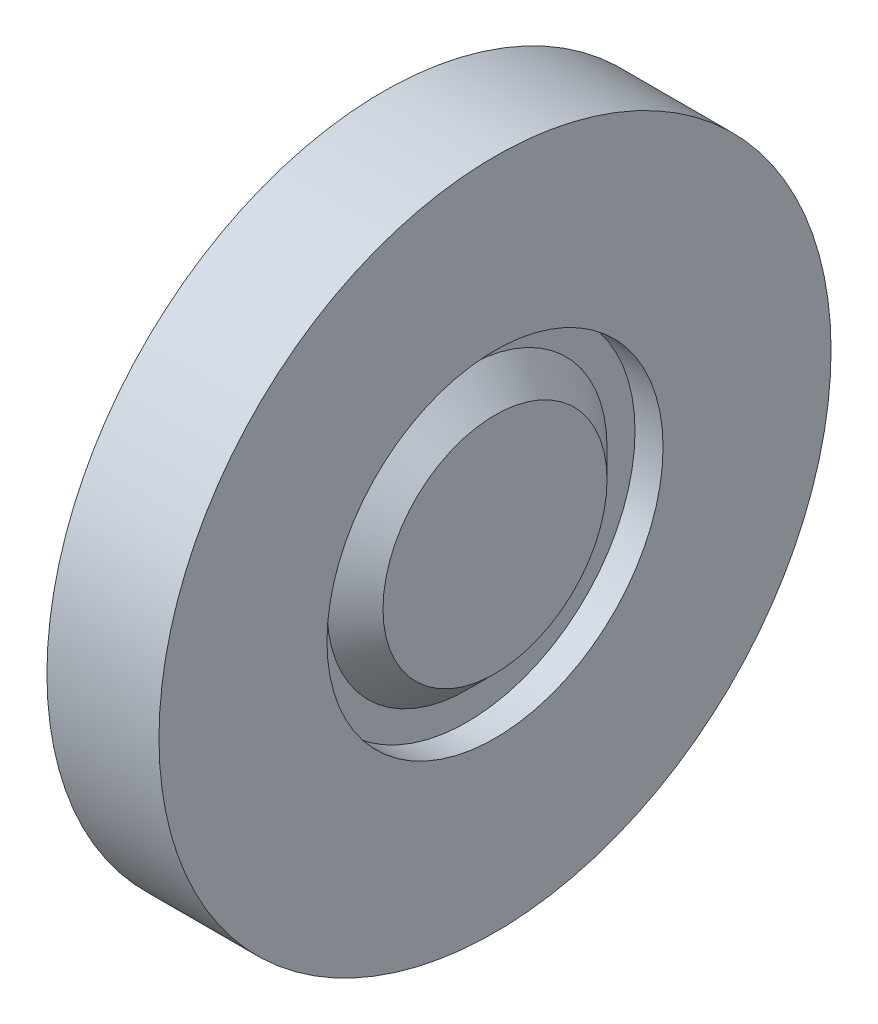
ISO-10303-21;
HEADER;
FILE_DESCRIPTION(('STEP AP214'),'2;1');
FILE_NAME('part.step','',(''),(''),'','','');
FILE_SCHEMA(('AUTOMOTIVE_DESIGN { 1 0 10303 214 1 1 1 1 }'));
ENDSEC;
DATA;
#1=APPLICATION_CONTEXT('core data for automotive mechanical design processes');
#2=APPLICATION_PROTOCOL_DEFINITION('international standard','automotive_design',2000,#1);
#3=PRODUCT_CONTEXT('',#1,'mechanical');
#4=PRODUCT('Part','Part','',(#3));
#5=PRODUCT_RELATED_PRODUCT_CATEGORY('part','',(#4));
#6=PRODUCT_DEFINITION_FORMATION('','',#4);
#7=PRODUCT_DEFINITION_CONTEXT('part definition',#1,'design');
#8=PRODUCT_DEFINITION('design','',#6,#7);
#9=PRODUCT_DEFINITION_SHAPE('','',#8);
#10=(LENGTH_UNIT() NAMED_UNIT(*) SI_UNIT(.MILLI.,.METRE.));
#11=(NAMED_UNIT(*) PLANE_ANGLE_UNIT() SI_UNIT($,.RADIAN.));
#12=(NAMED_UNIT(*) SI_UNIT($,.STERADIAN.) SOLID_ANGLE_UNIT());
#13=UNCERTAINTY_MEASURE_WITH_UNIT(LENGTH_MEASURE(1.E-05),#10,'distance_accuracy_value','');
#14=(GEOMETRIC_REPRESENTATION_CONTEXT(3) GLOBAL_UNCERTAINTY_ASSIGNED_CONTEXT((#13)) GLOBAL_UNIT_ASSIGNED_CONTEXT((#10,
#11,#12)) REPRESENTATION_CONTEXT('',''));
#15=CARTESIAN_POINT('',(0.,0.,0.));
#16=DIRECTION('',(0.,0.,1.));
#17=DIRECTION('',(1.,0.,0.));
#18=AXIS2_PLACEMENT_3D('',#15,#16,#17);
#19=CARTESIAN_POINT('',(1.5,0.,0.));
#20=DIRECTION('',(1.,0.,0.));
#21=DIRECTION('',(0.,0.,-1.));
#22=AXIS2_PLACEMENT_3D('',#19,#20,#21);
#23=PLANE('',#22);
#24=CARTESIAN_POINT('',(1.5,0.,0.));
#25=DIRECTION('',(1.,0.,0.));
#26=DIRECTION('',(0.,0.,-1.));
#27=AXIS2_PLACEMENT_3D('',#24,#25,#26);
#28=CIRCLE('',#27,3.);
#29=CARTESIAN_POINT('',(1.5,0.,-3.));
#30=VERTEX_POINT('',#29);
#31=EDGE_CURVE('E62',#30,#30,#28,.T.);
#32=ORIENTED_EDGE('',*,*,#31,.T.);
#33=EDGE_LOOP('',(#32));
#34=FACE_BOUND('',#33,.T.);
#35=CARTESIAN_POINT('',(1.5,0.,0.));
#36=DIRECTION('',(1.,0.,0.));
#37=DIRECTION('',(0.,0.,-1.));
#38=AXIS2_PLACEMENT_3D('',#35,#36,#37);
#39=CIRCLE('',#38,2.5);
#40=CARTESIAN_POINT('',(1.5,0.,-2.5));
#41=VERTEX_POINT('',#40);
#42=EDGE_CURVE('E70',#41,#41,#39,.T.);
#43=ORIENTED_EDGE('',*,*,#42,.F.);
#44=EDGE_LOOP('',(#43));
#45=FACE_BOUND('',#44,.T.);
#46=ADVANCED_FACE('F43',(#34,#45),#23,.T.);
#47=CARTESIAN_POINT('',(2.,0.,0.));
#48=DIRECTION('',(-1.,0.,0.));
#49=DIRECTION('',(0.,0.,1.));
#50=AXIS2_PLACEMENT_3D('',#47,#48,#49);
#51=CYLINDRICAL_SURFACE('',#50,6.);
#52=CARTESIAN_POINT('',(2.,0.,0.));
#53=DIRECTION('',(1.,0.,0.));
#54=DIRECTION('',(0.,0.,-1.));
#55=AXIS2_PLACEMENT_3D('',#52,#53,#54);
#56=CIRCLE('',#55,6.);
#57=CARTESIAN_POINT('',(2.,0.,-6.));
#58=VERTEX_POINT('',#57);
#59=EDGE_CURVE('E11',#58,#58,#56,.T.);
#60=ORIENTED_EDGE('',*,*,#59,.F.);
#61=EDGE_LOOP('',(#60));
#62=FACE_BOUND('',#61,.T.);
#63=CARTESIAN_POINT('',(0.,0.,0.));
#64=DIRECTION('',(1.,0.,0.));
#65=DIRECTION('',(0.,0.,-1.));
#66=AXIS2_PLACEMENT_3D('',#63,#64,#65);
#67=CIRCLE('',#66,6.);
#68=CARTESIAN_POINT('',(0.,0.,-6.));
#69=VERTEX_POINT('',#68);
#70=EDGE_CURVE('E47',#69,#69,#67,.T.);
#71=ORIENTED_EDGE('',*,*,#70,.T.);
#72=EDGE_LOOP('',(#71));
#73=FACE_BOUND('',#72,.T.);
#74=ADVANCED_FACE('F45',(#62,#73),#51,.T.);
#75=CARTESIAN_POINT('',(2.,0.,0.));
#76=DIRECTION('',(1.,0.,0.));
#77=DIRECTION('',(0.,0.,-1.));
#78=AXIS2_PLACEMENT_3D('',#75,#76,#77);
#79=PLANE('',#78);
#80=CARTESIAN_POINT('',(2.,0.,0.));
#81=DIRECTION('',(1.,0.,0.));
#82=DIRECTION('',(0.,0.,-1.));
#83=AXIS2_PLACEMENT_3D('',#80,#81,#82);
#84=CIRCLE('',#83,3.);
#85=CARTESIAN_POINT('',(2.,0.,-3.));
#86=VERTEX_POINT('',#85);
#87=EDGE_CURVE('E66',#86,#86,#84,.T.);
#88=ORIENTED_EDGE('',*,*,#87,.F.);
#89=EDGE_LOOP('',(#88));
#90=FACE_BOUND('',#89,.T.);
#91=ORIENTED_EDGE('',*,*,#59,.T.);
#92=EDGE_LOOP('',(#91));
#93=FACE_BOUND('',#92,.T.);
#94=ADVANCED_FACE('F122',(#90,#93),#79,.T.);
#95=CARTESIAN_POINT('',(0.,0.,0.));
#96=DIRECTION('',(1.,0.,0.));
#97=DIRECTION('',(0.,0.,-1.));
#98=AXIS2_PLACEMENT_3D('',#95,#96,#97);
#99=PLANE('',#98);
#100=CARTESIAN_POINT('',(0.,0.,0.));
#101=DIRECTION('',(-1.,0.,0.));
#102=DIRECTION('',(0.,0.,1.));
#103=AXIS2_PLACEMENT_3D('',#100,#101,#102);
#104=CIRCLE('',#103,0.7);
#105=CARTESIAN_POINT('',(0.,0.,0.7));
#106=VERTEX_POINT('',#105);
#107=EDGE_CURVE('E58',#106,#106,#104,.T.);
#108=ORIENTED_EDGE('',*,*,#107,.F.);
#109=EDGE_LOOP('',(#108));
#110=FACE_BOUND('',#109,.T.);
#111=ORIENTED_EDGE('',*,*,#70,.F.);
#112=EDGE_LOOP('',(#111));
#113=FACE_BOUND('',#112,.T.);
#114=ADVANCED_FACE('F132',(#110,#113),#99,.F.);
#115=CARTESIAN_POINT('',(0.5,0.,0.));
#116=DIRECTION('',(-1.,0.,0.));
#117=DIRECTION('',(0.,0.,1.));
#118=AXIS2_PLACEMENT_3D('',#115,#116,#117);
#119=CYLINDRICAL_SURFACE('',#118,0.7);
#120=CARTESIAN_POINT('',(0.5,0.,0.));
#121=DIRECTION('',(-1.,0.,0.));
#122=DIRECTION('',(0.,0.,1.));
#123=AXIS2_PLACEMENT_3D('',#120,#121,#122);
#124=CIRCLE('',#123,0.7);
#125=CARTESIAN_POINT('',(0.5,0.,0.7));
#126=VERTEX_POINT('',#125);
#127=EDGE_CURVE('E56',#126,#126,#124,.T.);
#128=ORIENTED_EDGE('',*,*,#127,.F.);
#129=EDGE_LOOP('',(#128));
#130=FACE_BOUND('',#129,.T.);
#131=ORIENTED_EDGE('',*,*,#107,.T.);
#132=EDGE_LOOP('',(#131));
#133=FACE_BOUND('',#132,.T.);
#134=ADVANCED_FACE('F137',(#130,#133),#119,.F.);
#135=CARTESIAN_POINT('',(0.5,0.,0.));
#136=DIRECTION('',(-1.,0.,0.));
#137=DIRECTION('',(0.,0.,1.));
#138=AXIS2_PLACEMENT_3D('',#135,#136,#137);
#139=PLANE('',#138);
#140=ORIENTED_EDGE('',*,*,#127,.T.);
#141=EDGE_LOOP('',(#140));
#142=FACE_BOUND('',#141,.T.);
#143=ADVANCED_FACE('F128',(#142),#139,.T.);
#144=CARTESIAN_POINT('',(1.5,0.,0.));
#145=DIRECTION('',(1.,0.,0.));
#146=DIRECTION('',(0.,0.,-1.));
#147=AXIS2_PLACEMENT_3D('',#144,#145,#146);
#148=CYLINDRICAL_SURFACE('',#147,3.);
#149=ORIENTED_EDGE('',*,*,#31,.F.);
#150=EDGE_LOOP('',(#149));
#151=FACE_BOUND('',#150,.T.);
#152=ORIENTED_EDGE('',*,*,#87,.T.);
#153=EDGE_LOOP('',(#152));
#154=FACE_BOUND('',#153,.T.);
#155=ADVANCED_FACE('F98',(#151,#154),#148,.F.);
#156=CARTESIAN_POINT('',(2.,0.,0.));
#157=DIRECTION('',(1.,0.,0.));
#158=DIRECTION('',(0.,0.,-1.));
#159=AXIS2_PLACEMENT_3D('',#156,#157,#158);
#160=PLANE('',#159);
#161=CARTESIAN_POINT('',(2.,0.,0.));
#162=DIRECTION('',(1.,0.,0.));
#163=DIRECTION('',(0.,0.,-1.));
#164=AXIS2_PLACEMENT_3D('',#161,#162,#163);
#165=CIRCLE('',#164,2.);
#166=CARTESIAN_POINT('',(2.,0.,-2.));
#167=VERTEX_POINT('',#166);
#168=EDGE_CURVE('E77',#167,#167,#165,.T.);
#169=ORIENTED_EDGE('',*,*,#168,.T.);
#170=EDGE_LOOP('',(#169));
#171=FACE_BOUND('',#170,.T.);
#172=ADVANCED_FACE('F88',(#171),#160,.T.);
#173=CARTESIAN_POINT('',(2.,0.,0.));
#174=DIRECTION('',(-1.,0.,0.));
#175=DIRECTION('',(0.,0.,1.));
#176=AXIS2_PLACEMENT_3D('',#173,#174,#175);
#177=CONICAL_SURFACE('',#176,2.,0.785398163397448);
#178=ORIENTED_EDGE('',*,*,#168,.F.);
#179=EDGE_LOOP('',(#178));
#180=FACE_BOUND('',#179,.T.);
#181=ORIENTED_EDGE('',*,*,#42,.T.);
#182=EDGE_LOOP('',(#181));
#183=FACE_BOUND('',#182,.T.);
#184=ADVANCED_FACE('F97',(#180,#183),#177,.T.);
#185=CLOSED_SHELL('',(#46,#74,#94,#114,#134,#143,#155,#172,#184));
#186=MANIFOLD_SOLID_BREP('B2',#185);
#187=ADVANCED_BREP_SHAPE_REPRESENTATION('',(#18,#186),#14);
#188=SHAPE_DEFINITION_REPRESENTATION(#9,#187);
ENDSEC;
END-ISO-10303-21;
